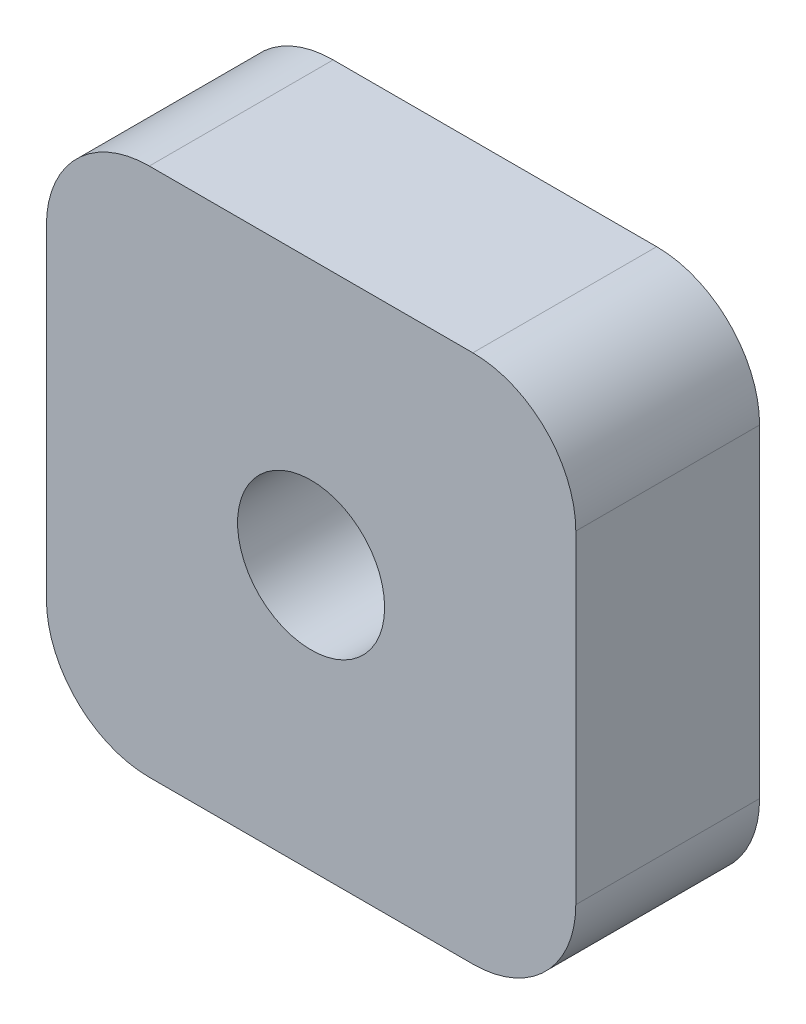
ISO-10303-21;
HEADER;
FILE_DESCRIPTION(('STEP AP214'),'2;1');
FILE_NAME('part.step','',(''),(''),'','','');
FILE_SCHEMA(('AUTOMOTIVE_DESIGN { 1 0 10303 214 1 1 1 1 }'));
ENDSEC;
DATA;
#1=APPLICATION_CONTEXT('core data for automotive mechanical design processes');
#2=APPLICATION_PROTOCOL_DEFINITION('international standard','automotive_design',2000,#1);
#3=PRODUCT_CONTEXT('',#1,'mechanical');
#4=PRODUCT('Part','Part','',(#3));
#5=PRODUCT_RELATED_PRODUCT_CATEGORY('part','',(#4));
#6=PRODUCT_DEFINITION_FORMATION('','',#4);
#7=PRODUCT_DEFINITION_CONTEXT('part definition',#1,'design');
#8=PRODUCT_DEFINITION('design','',#6,#7);
#9=PRODUCT_DEFINITION_SHAPE('','',#8);
#10=(LENGTH_UNIT() NAMED_UNIT(*) SI_UNIT(.MILLI.,.METRE.));
#11=(NAMED_UNIT(*) PLANE_ANGLE_UNIT() SI_UNIT($,.RADIAN.));
#12=(NAMED_UNIT(*) SI_UNIT($,.STERADIAN.) SOLID_ANGLE_UNIT());
#13=UNCERTAINTY_MEASURE_WITH_UNIT(LENGTH_MEASURE(1.E-05),#10,'distance_accuracy_value','');
#14=(GEOMETRIC_REPRESENTATION_CONTEXT(3) GLOBAL_UNCERTAINTY_ASSIGNED_CONTEXT((#13)) GLOBAL_UNIT_ASSIGNED_CONTEXT((#10,
#11,#12)) REPRESENTATION_CONTEXT('',''));
#15=CARTESIAN_POINT('',(0.,0.,0.));
#16=DIRECTION('',(0.,0.,1.));
#17=DIRECTION('',(1.,0.,0.));
#18=AXIS2_PLACEMENT_3D('',#15,#16,#17);
#19=CARTESIAN_POINT('',(-11.,-11.,0.));
#20=DIRECTION('',(0.,0.,1.));
#21=DIRECTION('',(1.,0.,0.));
#22=AXIS2_PLACEMENT_3D('',#19,#20,#21);
#23=PLANE('',#22);
#24=CARTESIAN_POINT('',(-11.,11.,0.));
#25=DIRECTION('',(0.,0.,-1.));
#26=DIRECTION('',(-1.,0.,0.));
#27=AXIS2_PLACEMENT_3D('',#24,#25,#26);
#28=CIRCLE('',#27,2.);
#29=CARTESIAN_POINT('',(-13.,11.,0.));
#30=VERTEX_POINT('',#29);
#31=EDGE_CURVE('E229',#30,#30,#28,.T.);
#32=ORIENTED_EDGE('',*,*,#31,.F.);
#33=EDGE_LOOP('',(#32));
#34=FACE_BOUND('',#33,.T.);
#35=CARTESIAN_POINT('',(11.,-11.,0.));
#36=DIRECTION('',(0.,0.,-1.));
#37=DIRECTION('',(-1.,0.,0.));
#38=AXIS2_PLACEMENT_3D('',#35,#36,#37);
#39=CIRCLE('',#38,2.);
#40=CARTESIAN_POINT('',(9.00000000000001,-11.,0.));
#41=VERTEX_POINT('',#40);
#42=EDGE_CURVE('E212',#41,#41,#39,.T.);
#43=ORIENTED_EDGE('',*,*,#42,.F.);
#44=EDGE_LOOP('',(#43));
#45=FACE_BOUND('',#44,.T.);
#46=CARTESIAN_POINT('',(11.,11.,0.));
#47=DIRECTION('',(0.,0.,-1.));
#48=DIRECTION('',(-1.,0.,0.));
#49=AXIS2_PLACEMENT_3D('',#46,#47,#48);
#50=CIRCLE('',#49,2.);
#51=CARTESIAN_POINT('',(9.00000000000004,11.,0.));
#52=VERTEX_POINT('',#51);
#53=EDGE_CURVE('E205',#52,#52,#50,.T.);
#54=ORIENTED_EDGE('',*,*,#53,.F.);
#55=EDGE_LOOP('',(#54));
#56=FACE_BOUND('',#55,.T.);
#57=CARTESIAN_POINT('',(-11.,-11.,0.));
#58=DIRECTION('',(0.,0.,1.));
#59=DIRECTION('',(1.,0.,0.));
#60=AXIS2_PLACEMENT_3D('',#57,#58,#59);
#61=CIRCLE('',#60,7.);
#62=CARTESIAN_POINT('',(-18.,-11.,0.));
#63=VERTEX_POINT('',#62);
#64=CARTESIAN_POINT('',(-11.,-18.,0.));
#65=VERTEX_POINT('',#64);
#66=EDGE_CURVE('E136',#63,#65,#61,.T.);
#67=ORIENTED_EDGE('',*,*,#66,.F.);
#68=DIRECTION('',(0.,-1.,0.));
#69=VECTOR('',#68,1.);
#70=CARTESIAN_POINT('',(-18.,11.,0.));
#71=LINE('',#70,#69);
#72=CARTESIAN_POINT('',(-18.,11.,0.));
#73=VERTEX_POINT('',#72);
#74=EDGE_CURVE('E95',#73,#63,#71,.T.);
#75=ORIENTED_EDGE('',*,*,#74,.F.);
#76=CARTESIAN_POINT('',(-11.,11.,0.));
#77=DIRECTION('',(0.,0.,1.));
#78=DIRECTION('',(1.,0.,0.));
#79=AXIS2_PLACEMENT_3D('',#76,#77,#78);
#80=CIRCLE('',#79,7.);
#81=CARTESIAN_POINT('',(-11.,18.,0.));
#82=VERTEX_POINT('',#81);
#83=EDGE_CURVE('E88',#82,#73,#80,.T.);
#84=ORIENTED_EDGE('',*,*,#83,.F.);
#85=DIRECTION('',(-1.,0.,0.));
#86=VECTOR('',#85,1.);
#87=CARTESIAN_POINT('',(-11.,18.,0.));
#88=LINE('',#87,#86);
#89=CARTESIAN_POINT('',(11.,18.,0.));
#90=VERTEX_POINT('',#89);
#91=EDGE_CURVE('E128',#90,#82,#88,.T.);
#92=ORIENTED_EDGE('',*,*,#91,.F.);
#93=CARTESIAN_POINT('',(11.,11.,0.));
#94=DIRECTION('',(0.,0.,1.));
#95=DIRECTION('',(1.,0.,0.));
#96=AXIS2_PLACEMENT_3D('',#93,#94,#95);
#97=CIRCLE('',#96,7.);
#98=CARTESIAN_POINT('',(18.,11.,0.));
#99=VERTEX_POINT('',#98);
#100=EDGE_CURVE('E147',#99,#90,#97,.T.);
#101=ORIENTED_EDGE('',*,*,#100,.F.);
#102=DIRECTION('',(0.,1.,0.));
#103=VECTOR('',#102,1.);
#104=CARTESIAN_POINT('',(18.,11.,0.));
#105=LINE('',#104,#103);
#106=CARTESIAN_POINT('',(18.,-11.,0.));
#107=VERTEX_POINT('',#106);
#108=EDGE_CURVE('E146',#107,#99,#105,.T.);
#109=ORIENTED_EDGE('',*,*,#108,.F.);
#110=CARTESIAN_POINT('',(11.,-11.,0.));
#111=DIRECTION('',(0.,0.,1.));
#112=DIRECTION('',(1.,0.,0.));
#113=AXIS2_PLACEMENT_3D('',#110,#111,#112);
#114=CIRCLE('',#113,7.);
#115=CARTESIAN_POINT('',(11.,-18.,0.));
#116=VERTEX_POINT('',#115);
#117=EDGE_CURVE('E148',#116,#107,#114,.T.);
#118=ORIENTED_EDGE('',*,*,#117,.F.);
#119=DIRECTION('',(1.,0.,0.));
#120=VECTOR('',#119,1.);
#121=CARTESIAN_POINT('',(-11.,-18.,0.));
#122=LINE('',#121,#120);
#123=EDGE_CURVE('E141',#65,#116,#122,.T.);
#124=ORIENTED_EDGE('',*,*,#123,.F.);
#125=EDGE_LOOP('',(#67,#75,#84,#92,#101,#109,#118,#124));
#126=FACE_BOUND('',#125,.T.);
#127=CARTESIAN_POINT('',(0.,0.,0.));
#128=DIRECTION('',(0.,0.,1.));
#129=DIRECTION('',(1.,0.,0.));
#130=AXIS2_PLACEMENT_3D('',#127,#128,#129);
#131=CIRCLE('',#130,5.);
#132=CARTESIAN_POINT('',(5.00000000000001,0.,0.));
#133=VERTEX_POINT('',#132);
#134=EDGE_CURVE('E190',#133,#133,#131,.T.);
#135=ORIENTED_EDGE('',*,*,#134,.T.);
#136=EDGE_LOOP('',(#135));
#137=FACE_BOUND('',#136,.T.);
#138=CARTESIAN_POINT('',(-11.,-11.,0.));
#139=DIRECTION('',(0.,0.,-1.));
#140=DIRECTION('',(-1.,0.,0.));
#141=AXIS2_PLACEMENT_3D('',#138,#139,#140);
#142=CIRCLE('',#141,2.);
#143=CARTESIAN_POINT('',(-13.,-11.,0.));
#144=VERTEX_POINT('',#143);
#145=EDGE_CURVE('E236',#144,#144,#142,.T.);
#146=ORIENTED_EDGE('',*,*,#145,.F.);
#147=EDGE_LOOP('',(#146));
#148=FACE_BOUND('',#147,.T.);
#149=ADVANCED_FACE('F39',(#34,#45,#56,#126,#137,#148),#23,.F.);
#150=CARTESIAN_POINT('',(-11.,-11.,12.5));
#151=DIRECTION('',(0.,0.,1.));
#152=DIRECTION('',(1.,0.,0.));
#153=AXIS2_PLACEMENT_3D('',#150,#151,#152);
#154=PLANE('',#153);
#155=CARTESIAN_POINT('',(-11.,-11.,12.5));
#156=DIRECTION('',(0.,0.,1.));
#157=DIRECTION('',(1.,0.,0.));
#158=AXIS2_PLACEMENT_3D('',#155,#156,#157);
#159=CIRCLE('',#158,7.);
#160=CARTESIAN_POINT('',(-18.,-11.,12.5));
#161=VERTEX_POINT('',#160);
#162=CARTESIAN_POINT('',(-11.,-18.,12.5));
#163=VERTEX_POINT('',#162);
#164=EDGE_CURVE('E154',#161,#163,#159,.T.);
#165=ORIENTED_EDGE('',*,*,#164,.T.);
#166=DIRECTION('',(1.,0.,0.));
#167=VECTOR('',#166,1.);
#168=CARTESIAN_POINT('',(-11.,-18.,12.5));
#169=LINE('',#168,#167);
#170=CARTESIAN_POINT('',(11.,-18.,12.5));
#171=VERTEX_POINT('',#170);
#172=EDGE_CURVE('E99',#163,#171,#169,.T.);
#173=ORIENTED_EDGE('',*,*,#172,.T.);
#174=CARTESIAN_POINT('',(11.,-11.,12.5));
#175=DIRECTION('',(0.,0.,1.));
#176=DIRECTION('',(1.,0.,0.));
#177=AXIS2_PLACEMENT_3D('',#174,#175,#176);
#178=CIRCLE('',#177,7.);
#179=CARTESIAN_POINT('',(18.,-11.,12.5));
#180=VERTEX_POINT('',#179);
#181=EDGE_CURVE('E168',#171,#180,#178,.T.);
#182=ORIENTED_EDGE('',*,*,#181,.T.);
#183=DIRECTION('',(0.,1.,0.));
#184=VECTOR('',#183,1.);
#185=CARTESIAN_POINT('',(18.,11.,12.5));
#186=LINE('',#185,#184);
#187=CARTESIAN_POINT('',(18.,11.,12.5));
#188=VERTEX_POINT('',#187);
#189=EDGE_CURVE('E185',#180,#188,#186,.T.);
#190=ORIENTED_EDGE('',*,*,#189,.T.);
#191=CARTESIAN_POINT('',(11.,11.,12.5));
#192=DIRECTION('',(0.,0.,1.));
#193=DIRECTION('',(1.,0.,0.));
#194=AXIS2_PLACEMENT_3D('',#191,#192,#193);
#195=CIRCLE('',#194,7.);
#196=CARTESIAN_POINT('',(11.,18.,12.5));
#197=VERTEX_POINT('',#196);
#198=EDGE_CURVE('E124',#188,#197,#195,.T.);
#199=ORIENTED_EDGE('',*,*,#198,.T.);
#200=DIRECTION('',(-1.,0.,0.));
#201=VECTOR('',#200,1.);
#202=CARTESIAN_POINT('',(-11.,18.,12.5));
#203=LINE('',#202,#201);
#204=CARTESIAN_POINT('',(-11.,18.,12.5));
#205=VERTEX_POINT('',#204);
#206=EDGE_CURVE('E113',#197,#205,#203,.T.);
#207=ORIENTED_EDGE('',*,*,#206,.T.);
#208=CARTESIAN_POINT('',(-11.,11.,12.5));
#209=DIRECTION('',(0.,0.,1.));
#210=DIRECTION('',(1.,0.,0.));
#211=AXIS2_PLACEMENT_3D('',#208,#209,#210);
#212=CIRCLE('',#211,7.);
#213=CARTESIAN_POINT('',(-18.,11.,12.5));
#214=VERTEX_POINT('',#213);
#215=EDGE_CURVE('E117',#205,#214,#212,.T.);
#216=ORIENTED_EDGE('',*,*,#215,.T.);
#217=DIRECTION('',(0.,-1.,0.));
#218=VECTOR('',#217,1.);
#219=CARTESIAN_POINT('',(-18.,11.,12.5));
#220=LINE('',#219,#218);
#221=EDGE_CURVE('E57',#214,#161,#220,.T.);
#222=ORIENTED_EDGE('',*,*,#221,.T.);
#223=EDGE_LOOP('',(#165,#173,#182,#190,#199,#207,#216,#222));
#224=FACE_BOUND('',#223,.T.);
#225=CARTESIAN_POINT('',(0.,0.,12.5));
#226=DIRECTION('',(0.,0.,1.));
#227=DIRECTION('',(1.,0.,0.));
#228=AXIS2_PLACEMENT_3D('',#225,#226,#227);
#229=CIRCLE('',#228,5.);
#230=CARTESIAN_POINT('',(5.00000000000001,0.,12.5));
#231=VERTEX_POINT('',#230);
#232=EDGE_CURVE('E145',#231,#231,#229,.T.);
#233=ORIENTED_EDGE('',*,*,#232,.F.);
#234=EDGE_LOOP('',(#233));
#235=FACE_BOUND('',#234,.T.);
#236=ADVANCED_FACE('F116',(#224,#235),#154,.T.);
#237=CARTESIAN_POINT('',(-11.,-11.,12.5));
#238=DIRECTION('',(0.,0.,-1.));
#239=DIRECTION('',(-1.,0.,0.));
#240=AXIS2_PLACEMENT_3D('',#237,#238,#239);
#241=CYLINDRICAL_SURFACE('',#240,7.);
#242=ORIENTED_EDGE('',*,*,#66,.T.);
#243=DIRECTION('',(0.,0.,-1.));
#244=VECTOR('',#243,1.);
#245=CARTESIAN_POINT('',(-11.,-18.,12.5));
#246=LINE('',#245,#244);
#247=EDGE_CURVE('E11',#163,#65,#246,.T.);
#248=ORIENTED_EDGE('',*,*,#247,.F.);
#249=ORIENTED_EDGE('',*,*,#164,.F.);
#250=DIRECTION('',(0.,0.,-1.));
#251=VECTOR('',#250,1.);
#252=CARTESIAN_POINT('',(-18.,-11.,12.5));
#253=LINE('',#252,#251);
#254=EDGE_CURVE('E138',#161,#63,#253,.T.);
#255=ORIENTED_EDGE('',*,*,#254,.T.);
#256=EDGE_LOOP('',(#242,#248,#249,#255));
#257=FACE_BOUND('',#256,.T.);
#258=ADVANCED_FACE('F41',(#257),#241,.T.);
#259=CARTESIAN_POINT('',(-11.,-18.,12.5));
#260=DIRECTION('',(0.,1.,0.));
#261=DIRECTION('',(-1.,0.,0.));
#262=AXIS2_PLACEMENT_3D('',#259,#260,#261);
#263=PLANE('',#262);
#264=ORIENTED_EDGE('',*,*,#123,.T.);
#265=DIRECTION('',(0.,0.,-1.));
#266=VECTOR('',#265,1.);
#267=CARTESIAN_POINT('',(11.,-18.,12.5));
#268=LINE('',#267,#266);
#269=EDGE_CURVE('E48',#171,#116,#268,.T.);
#270=ORIENTED_EDGE('',*,*,#269,.F.);
#271=ORIENTED_EDGE('',*,*,#172,.F.);
#272=ORIENTED_EDGE('',*,*,#247,.T.);
#273=EDGE_LOOP('',(#264,#270,#271,#272));
#274=FACE_BOUND('',#273,.T.);
#275=ADVANCED_FACE('F269',(#274),#263,.F.);
#276=CARTESIAN_POINT('',(11.,-11.,12.5));
#277=DIRECTION('',(0.,0.,-1.));
#278=DIRECTION('',(-1.,0.,0.));
#279=AXIS2_PLACEMENT_3D('',#276,#277,#278);
#280=CYLINDRICAL_SURFACE('',#279,7.);
#281=ORIENTED_EDGE('',*,*,#117,.T.);
#282=DIRECTION('',(0.,0.,-1.));
#283=VECTOR('',#282,1.);
#284=CARTESIAN_POINT('',(18.,-11.,12.5));
#285=LINE('',#284,#283);
#286=EDGE_CURVE('E165',#180,#107,#285,.T.);
#287=ORIENTED_EDGE('',*,*,#286,.F.);
#288=ORIENTED_EDGE('',*,*,#181,.F.);
#289=ORIENTED_EDGE('',*,*,#269,.T.);
#290=EDGE_LOOP('',(#281,#287,#288,#289));
#291=FACE_BOUND('',#290,.T.);
#292=ADVANCED_FACE('F169',(#291),#280,.T.);
#293=CARTESIAN_POINT('',(18.,11.,12.5));
#294=DIRECTION('',(-1.,0.,0.));
#295=DIRECTION('',(0.,-1.,0.));
#296=AXIS2_PLACEMENT_3D('',#293,#294,#295);
#297=PLANE('',#296);
#298=ORIENTED_EDGE('',*,*,#108,.T.);
#299=DIRECTION('',(0.,0.,-1.));
#300=VECTOR('',#299,1.);
#301=CARTESIAN_POINT('',(18.,11.,12.5));
#302=LINE('',#301,#300);
#303=EDGE_CURVE('E157',#188,#99,#302,.T.);
#304=ORIENTED_EDGE('',*,*,#303,.F.);
#305=ORIENTED_EDGE('',*,*,#189,.F.);
#306=ORIENTED_EDGE('',*,*,#286,.T.);
#307=EDGE_LOOP('',(#298,#304,#305,#306));
#308=FACE_BOUND('',#307,.T.);
#309=ADVANCED_FACE('F177',(#308),#297,.F.);
#310=CARTESIAN_POINT('',(11.,11.,12.5));
#311=DIRECTION('',(0.,0.,-1.));
#312=DIRECTION('',(-1.,0.,0.));
#313=AXIS2_PLACEMENT_3D('',#310,#311,#312);
#314=CYLINDRICAL_SURFACE('',#313,7.);
#315=ORIENTED_EDGE('',*,*,#100,.T.);
#316=DIRECTION('',(0.,0.,-1.));
#317=VECTOR('',#316,1.);
#318=CARTESIAN_POINT('',(11.,18.,12.5));
#319=LINE('',#318,#317);
#320=EDGE_CURVE('E134',#197,#90,#319,.T.);
#321=ORIENTED_EDGE('',*,*,#320,.F.);
#322=ORIENTED_EDGE('',*,*,#198,.F.);
#323=ORIENTED_EDGE('',*,*,#303,.T.);
#324=EDGE_LOOP('',(#315,#321,#322,#323));
#325=FACE_BOUND('',#324,.T.);
#326=ADVANCED_FACE('F182',(#325),#314,.T.);
#327=CARTESIAN_POINT('',(-11.,18.,12.5));
#328=DIRECTION('',(0.,-1.,0.));
#329=DIRECTION('',(1.,0.,0.));
#330=AXIS2_PLACEMENT_3D('',#327,#328,#329);
#331=PLANE('',#330);
#332=ORIENTED_EDGE('',*,*,#91,.T.);
#333=DIRECTION('',(0.,0.,-1.));
#334=VECTOR('',#333,1.);
#335=CARTESIAN_POINT('',(-11.,18.,12.5));
#336=LINE('',#335,#334);
#337=EDGE_CURVE('E130',#205,#82,#336,.T.);
#338=ORIENTED_EDGE('',*,*,#337,.F.);
#339=ORIENTED_EDGE('',*,*,#206,.F.);
#340=ORIENTED_EDGE('',*,*,#320,.T.);
#341=EDGE_LOOP('',(#332,#338,#339,#340));
#342=FACE_BOUND('',#341,.T.);
#343=ADVANCED_FACE('F126',(#342),#331,.F.);
#344=CARTESIAN_POINT('',(-11.,11.,12.5));
#345=DIRECTION('',(0.,0.,-1.));
#346=DIRECTION('',(-1.,0.,0.));
#347=AXIS2_PLACEMENT_3D('',#344,#345,#346);
#348=CYLINDRICAL_SURFACE('',#347,7.);
#349=ORIENTED_EDGE('',*,*,#83,.T.);
#350=DIRECTION('',(0.,0.,-1.));
#351=VECTOR('',#350,1.);
#352=CARTESIAN_POINT('',(-18.,11.,12.5));
#353=LINE('',#352,#351);
#354=EDGE_CURVE('E131',#214,#73,#353,.T.);
#355=ORIENTED_EDGE('',*,*,#354,.F.);
#356=ORIENTED_EDGE('',*,*,#215,.F.);
#357=ORIENTED_EDGE('',*,*,#337,.T.);
#358=EDGE_LOOP('',(#349,#355,#356,#357));
#359=FACE_BOUND('',#358,.T.);
#360=ADVANCED_FACE('F133',(#359),#348,.T.);
#361=CARTESIAN_POINT('',(-18.,11.,12.5));
#362=DIRECTION('',(1.,0.,0.));
#363=DIRECTION('',(0.,0.,-1.));
#364=AXIS2_PLACEMENT_3D('',#361,#362,#363);
#365=PLANE('',#364);
#366=ORIENTED_EDGE('',*,*,#74,.T.);
#367=ORIENTED_EDGE('',*,*,#254,.F.);
#368=ORIENTED_EDGE('',*,*,#221,.F.);
#369=ORIENTED_EDGE('',*,*,#354,.T.);
#370=EDGE_LOOP('',(#366,#367,#368,#369));
#371=FACE_BOUND('',#370,.T.);
#372=ADVANCED_FACE('F260',(#371),#365,.F.);
#373=CARTESIAN_POINT('',(0.,0.,12.5));
#374=DIRECTION('',(0.,0.,-1.));
#375=DIRECTION('',(-1.,0.,0.));
#376=AXIS2_PLACEMENT_3D('',#373,#374,#375);
#377=CYLINDRICAL_SURFACE('',#376,5.);
#378=ORIENTED_EDGE('',*,*,#232,.T.);
#379=EDGE_LOOP('',(#378));
#380=FACE_BOUND('',#379,.T.);
#381=ORIENTED_EDGE('',*,*,#134,.F.);
#382=EDGE_LOOP('',(#381));
#383=FACE_BOUND('',#382,.T.);
#384=ADVANCED_FACE('F257',(#380,#383),#377,.F.);
#385=CARTESIAN_POINT('',(11.,11.,7.));
#386=DIRECTION('',(0.,0.,-1.));
#387=DIRECTION('',(-1.,0.,0.));
#388=AXIS2_PLACEMENT_3D('',#385,#386,#387);
#389=CONICAL_SURFACE('',#388,1.65,1.02974425867665);
#390=CARTESIAN_POINT('',(11.,11.,7.99142002139547));
#391=VERTEX_POINT('',#390);
#392=VERTEX_LOOP('',#391);
#393=FACE_BOUND('',#392,.T.);
#394=CARTESIAN_POINT('',(11.,11.,7.));
#395=DIRECTION('',(0.,0.,-1.));
#396=DIRECTION('',(-1.,0.,0.));
#397=AXIS2_PLACEMENT_3D('',#394,#395,#396);
#398=CIRCLE('',#397,1.65);
#399=CARTESIAN_POINT('',(9.35000000000004,11.,7.));
#400=VERTEX_POINT('',#399);
#401=EDGE_CURVE('E193',#400,#400,#398,.T.);
#402=ORIENTED_EDGE('',*,*,#401,.T.);
#403=EDGE_LOOP('',(#402));
#404=FACE_BOUND('',#403,.T.);
#405=ADVANCED_FACE('F330',(#393,#404),#389,.F.);
#406=CARTESIAN_POINT('',(11.,11.,0.));
#407=DIRECTION('',(0.,0.,-1.));
#408=DIRECTION('',(-1.,0.,0.));
#409=AXIS2_PLACEMENT_3D('',#406,#407,#408);
#410=CYLINDRICAL_SURFACE('',#409,1.65);
#411=ORIENTED_EDGE('',*,*,#401,.F.);
#412=EDGE_LOOP('',(#411));
#413=FACE_BOUND('',#412,.T.);
#414=CARTESIAN_POINT('',(11.,11.,4.));
#415=DIRECTION('',(0.,0.,-1.));
#416=DIRECTION('',(-1.,0.,0.));
#417=AXIS2_PLACEMENT_3D('',#414,#415,#416);
#418=CIRCLE('',#417,1.65);
#419=CARTESIAN_POINT('',(9.35000000000004,11.,4.));
#420=VERTEX_POINT('',#419);
#421=EDGE_CURVE('E198',#420,#420,#418,.T.);
#422=ORIENTED_EDGE('',*,*,#421,.T.);
#423=EDGE_LOOP('',(#422));
#424=FACE_BOUND('',#423,.T.);
#425=ADVANCED_FACE('F338',(#413,#424),#410,.F.);
#426=CARTESIAN_POINT('',(12.65,11.,4.));
#427=DIRECTION('',(0.,0.,1.));
#428=DIRECTION('',(1.,0.,0.));
#429=AXIS2_PLACEMENT_3D('',#426,#427,#428);
#430=PLANE('',#429);
#431=ORIENTED_EDGE('',*,*,#421,.F.);
#432=EDGE_LOOP('',(#431));
#433=FACE_BOUND('',#432,.T.);
#434=CARTESIAN_POINT('',(11.,11.,4.));
#435=DIRECTION('',(0.,0.,-1.));
#436=DIRECTION('',(-1.,0.,0.));
#437=AXIS2_PLACEMENT_3D('',#434,#435,#436);
#438=CIRCLE('',#437,2.);
#439=CARTESIAN_POINT('',(9.00000000000004,11.,4.));
#440=VERTEX_POINT('',#439);
#441=EDGE_CURVE('E200',#440,#440,#438,.T.);
#442=ORIENTED_EDGE('',*,*,#441,.T.);
#443=EDGE_LOOP('',(#442));
#444=FACE_BOUND('',#443,.T.);
#445=ADVANCED_FACE('F346',(#433,#444),#430,.F.);
#446=CARTESIAN_POINT('',(11.,11.,0.));
#447=DIRECTION('',(0.,0.,-1.));
#448=DIRECTION('',(-1.,0.,0.));
#449=AXIS2_PLACEMENT_3D('',#446,#447,#448);
#450=CYLINDRICAL_SURFACE('',#449,2.);
#451=ORIENTED_EDGE('',*,*,#441,.F.);
#452=EDGE_LOOP('',(#451));
#453=FACE_BOUND('',#452,.T.);
#454=ORIENTED_EDGE('',*,*,#53,.T.);
#455=EDGE_LOOP('',(#454));
#456=FACE_BOUND('',#455,.T.);
#457=ADVANCED_FACE('F359',(#453,#456),#450,.F.);
#458=CARTESIAN_POINT('',(11.,-11.,7.));
#459=DIRECTION('',(0.,0.,-1.));
#460=DIRECTION('',(-1.,0.,0.));
#461=AXIS2_PLACEMENT_3D('',#458,#459,#460);
#462=CONICAL_SURFACE('',#461,1.65,1.02974425867665);
#463=CARTESIAN_POINT('',(11.,-11.,7.99142002139547));
#464=VERTEX_POINT('',#463);
#465=VERTEX_LOOP('',#464);
#466=FACE_BOUND('',#465,.T.);
#467=CARTESIAN_POINT('',(11.,-11.,7.));
#468=DIRECTION('',(0.,0.,-1.));
#469=DIRECTION('',(-1.,0.,0.));
#470=AXIS2_PLACEMENT_3D('',#467,#468,#469);
#471=CIRCLE('',#470,1.65);
#472=CARTESIAN_POINT('',(9.35000000000001,-11.,7.));
#473=VERTEX_POINT('',#472);
#474=EDGE_CURVE('E202',#473,#473,#471,.T.);
#475=ORIENTED_EDGE('',*,*,#474,.T.);
#476=EDGE_LOOP('',(#475));
#477=FACE_BOUND('',#476,.T.);
#478=ADVANCED_FACE('F368',(#466,#477),#462,.F.);
#479=CARTESIAN_POINT('',(11.,-11.,0.));
#480=DIRECTION('',(0.,0.,-1.));
#481=DIRECTION('',(-1.,0.,0.));
#482=AXIS2_PLACEMENT_3D('',#479,#480,#481);
#483=CYLINDRICAL_SURFACE('',#482,1.65);
#484=ORIENTED_EDGE('',*,*,#474,.F.);
#485=EDGE_LOOP('',(#484));
#486=FACE_BOUND('',#485,.T.);
#487=CARTESIAN_POINT('',(11.,-11.,4.));
#488=DIRECTION('',(0.,0.,-1.));
#489=DIRECTION('',(-1.,0.,0.));
#490=AXIS2_PLACEMENT_3D('',#487,#488,#489);
#491=CIRCLE('',#490,1.65);
#492=CARTESIAN_POINT('',(9.35000000000001,-11.,4.));
#493=VERTEX_POINT('',#492);
#494=EDGE_CURVE('E208',#493,#493,#491,.T.);
#495=ORIENTED_EDGE('',*,*,#494,.T.);
#496=EDGE_LOOP('',(#495));
#497=FACE_BOUND('',#496,.T.);
#498=ADVANCED_FACE('F374',(#486,#497),#483,.F.);
#499=CARTESIAN_POINT('',(12.65,-11.,4.));
#500=DIRECTION('',(0.,0.,1.));
#501=DIRECTION('',(1.,0.,0.));
#502=AXIS2_PLACEMENT_3D('',#499,#500,#501);
#503=PLANE('',#502);
#504=ORIENTED_EDGE('',*,*,#494,.F.);
#505=EDGE_LOOP('',(#504));
#506=FACE_BOUND('',#505,.T.);
#507=CARTESIAN_POINT('',(11.,-11.,4.));
#508=DIRECTION('',(0.,0.,-1.));
#509=DIRECTION('',(-1.,0.,0.));
#510=AXIS2_PLACEMENT_3D('',#507,#508,#509);
#511=CIRCLE('',#510,2.);
#512=CARTESIAN_POINT('',(9.00000000000001,-11.,4.));
#513=VERTEX_POINT('',#512);
#514=EDGE_CURVE('E211',#513,#513,#511,.T.);
#515=ORIENTED_EDGE('',*,*,#514,.T.);
#516=EDGE_LOOP('',(#515));
#517=FACE_BOUND('',#516,.T.);
#518=ADVANCED_FACE('F383',(#506,#517),#503,.F.);
#519=CARTESIAN_POINT('',(11.,-11.,0.));
#520=DIRECTION('',(0.,0.,-1.));
#521=DIRECTION('',(-1.,0.,0.));
#522=AXIS2_PLACEMENT_3D('',#519,#520,#521);
#523=CYLINDRICAL_SURFACE('',#522,2.);
#524=ORIENTED_EDGE('',*,*,#514,.F.);
#525=EDGE_LOOP('',(#524));
#526=FACE_BOUND('',#525,.T.);
#527=ORIENTED_EDGE('',*,*,#42,.T.);
#528=EDGE_LOOP('',(#527));
#529=FACE_BOUND('',#528,.T.);
#530=ADVANCED_FACE('F395',(#526,#529),#523,.F.);
#531=CARTESIAN_POINT('',(-11.,11.,7.));
#532=DIRECTION('',(0.,0.,-1.));
#533=DIRECTION('',(-1.,0.,0.));
#534=AXIS2_PLACEMENT_3D('',#531,#532,#533);
#535=CONICAL_SURFACE('',#534,1.65,1.02974425867665);
#536=CARTESIAN_POINT('',(-11.,11.,7.99142002139547));
#537=VERTEX_POINT('',#536);
#538=VERTEX_LOOP('',#537);
#539=FACE_BOUND('',#538,.T.);
#540=CARTESIAN_POINT('',(-11.,11.,7.));
#541=DIRECTION('',(0.,0.,-1.));
#542=DIRECTION('',(-1.,0.,0.));
#543=AXIS2_PLACEMENT_3D('',#540,#541,#542);
#544=CIRCLE('',#543,1.65);
#545=CARTESIAN_POINT('',(-12.65,11.,7.));
#546=VERTEX_POINT('',#545);
#547=EDGE_CURVE('E220',#546,#546,#544,.T.);
#548=ORIENTED_EDGE('',*,*,#547,.T.);
#549=EDGE_LOOP('',(#548));
#550=FACE_BOUND('',#549,.T.);
#551=ADVANCED_FACE('F405',(#539,#550),#535,.F.);
#552=CARTESIAN_POINT('',(-11.,11.,0.));
#553=DIRECTION('',(0.,0.,-1.));
#554=DIRECTION('',(-1.,0.,0.));
#555=AXIS2_PLACEMENT_3D('',#552,#553,#554);
#556=CYLINDRICAL_SURFACE('',#555,1.65);
#557=ORIENTED_EDGE('',*,*,#547,.F.);
#558=EDGE_LOOP('',(#557));
#559=FACE_BOUND('',#558,.T.);
#560=CARTESIAN_POINT('',(-11.,11.,4.));
#561=DIRECTION('',(0.,0.,-1.));
#562=DIRECTION('',(-1.,0.,0.));
#563=AXIS2_PLACEMENT_3D('',#560,#561,#562);
#564=CIRCLE('',#563,1.65);
#565=CARTESIAN_POINT('',(-12.65,11.,4.));
#566=VERTEX_POINT('',#565);
#567=EDGE_CURVE('E219',#566,#566,#564,.T.);
#568=ORIENTED_EDGE('',*,*,#567,.T.);
#569=EDGE_LOOP('',(#568));
#570=FACE_BOUND('',#569,.T.);
#571=ADVANCED_FACE('F413',(#559,#570),#556,.F.);
#572=CARTESIAN_POINT('',(-9.35000000000002,11.,4.));
#573=DIRECTION('',(0.,0.,1.));
#574=DIRECTION('',(1.,0.,0.));
#575=AXIS2_PLACEMENT_3D('',#572,#573,#574);
#576=PLANE('',#575);
#577=ORIENTED_EDGE('',*,*,#567,.F.);
#578=EDGE_LOOP('',(#577));
#579=FACE_BOUND('',#578,.T.);
#580=CARTESIAN_POINT('',(-11.,11.,4.));
#581=DIRECTION('',(0.,0.,-1.));
#582=DIRECTION('',(-1.,0.,0.));
#583=AXIS2_PLACEMENT_3D('',#580,#581,#582);
#584=CIRCLE('',#583,2.);
#585=CARTESIAN_POINT('',(-13.,11.,4.));
#586=VERTEX_POINT('',#585);
#587=EDGE_CURVE('E224',#586,#586,#584,.T.);
#588=ORIENTED_EDGE('',*,*,#587,.T.);
#589=EDGE_LOOP('',(#588));
#590=FACE_BOUND('',#589,.T.);
#591=ADVANCED_FACE('F419',(#579,#590),#576,.F.);
#592=CARTESIAN_POINT('',(-11.,11.,0.));
#593=DIRECTION('',(0.,0.,-1.));
#594=DIRECTION('',(-1.,0.,0.));
#595=AXIS2_PLACEMENT_3D('',#592,#593,#594);
#596=CYLINDRICAL_SURFACE('',#595,2.);
#597=ORIENTED_EDGE('',*,*,#587,.F.);
#598=EDGE_LOOP('',(#597));
#599=FACE_BOUND('',#598,.T.);
#600=ORIENTED_EDGE('',*,*,#31,.T.);
#601=EDGE_LOOP('',(#600));
#602=FACE_BOUND('',#601,.T.);
#603=ADVANCED_FACE('F427',(#599,#602),#596,.F.);
#604=CARTESIAN_POINT('',(-11.,-11.,7.));
#605=DIRECTION('',(0.,0.,-1.));
#606=DIRECTION('',(-1.,0.,0.));
#607=AXIS2_PLACEMENT_3D('',#604,#605,#606);
#608=CONICAL_SURFACE('',#607,1.65,1.02974425867665);
#609=CARTESIAN_POINT('',(-11.,-11.,7.99142002139547));
#610=VERTEX_POINT('',#609);
#611=VERTEX_LOOP('',#610);
#612=FACE_BOUND('',#611,.T.);
#613=CARTESIAN_POINT('',(-11.,-11.,7.));
#614=DIRECTION('',(0.,0.,-1.));
#615=DIRECTION('',(-1.,0.,0.));
#616=AXIS2_PLACEMENT_3D('',#613,#614,#615);
#617=CIRCLE('',#616,1.65);
#618=CARTESIAN_POINT('',(-12.65,-11.,7.));
#619=VERTEX_POINT('',#618);
#620=EDGE_CURVE('E228',#619,#619,#617,.T.);
#621=ORIENTED_EDGE('',*,*,#620,.T.);
#622=EDGE_LOOP('',(#621));
#623=FACE_BOUND('',#622,.T.);
#624=ADVANCED_FACE('F437',(#612,#623),#608,.F.);
#625=CARTESIAN_POINT('',(-11.,-11.,0.));
#626=DIRECTION('',(0.,0.,-1.));
#627=DIRECTION('',(-1.,0.,0.));
#628=AXIS2_PLACEMENT_3D('',#625,#626,#627);
#629=CYLINDRICAL_SURFACE('',#628,1.65);
#630=ORIENTED_EDGE('',*,*,#620,.F.);
#631=EDGE_LOOP('',(#630));
#632=FACE_BOUND('',#631,.T.);
#633=CARTESIAN_POINT('',(-11.,-11.,4.));
#634=DIRECTION('',(0.,0.,-1.));
#635=DIRECTION('',(-1.,0.,0.));
#636=AXIS2_PLACEMENT_3D('',#633,#634,#635);
#637=CIRCLE('',#636,1.65);
#638=CARTESIAN_POINT('',(-12.65,-11.,4.));
#639=VERTEX_POINT('',#638);
#640=EDGE_CURVE('E234',#639,#639,#637,.T.);
#641=ORIENTED_EDGE('',*,*,#640,.T.);
#642=EDGE_LOOP('',(#641));
#643=FACE_BOUND('',#642,.T.);
#644=ADVANCED_FACE('F446',(#632,#643),#629,.F.);
#645=CARTESIAN_POINT('',(-9.35,-11.,4.));
#646=DIRECTION('',(0.,0.,1.));
#647=DIRECTION('',(1.,0.,0.));
#648=AXIS2_PLACEMENT_3D('',#645,#646,#647);
#649=PLANE('',#648);
#650=ORIENTED_EDGE('',*,*,#640,.F.);
#651=EDGE_LOOP('',(#650));
#652=FACE_BOUND('',#651,.T.);
#653=CARTESIAN_POINT('',(-11.,-11.,4.));
#654=DIRECTION('',(0.,0.,-1.));
#655=DIRECTION('',(-1.,0.,0.));
#656=AXIS2_PLACEMENT_3D('',#653,#654,#655);
#657=CIRCLE('',#656,2.);
#658=CARTESIAN_POINT('',(-13.,-11.,4.));
#659=VERTEX_POINT('',#658);
#660=EDGE_CURVE('E231',#659,#659,#657,.T.);
#661=ORIENTED_EDGE('',*,*,#660,.T.);
#662=EDGE_LOOP('',(#661));
#663=FACE_BOUND('',#662,.T.);
#664=ADVANCED_FACE('F457',(#652,#663),#649,.F.);
#665=CARTESIAN_POINT('',(-11.,-11.,0.));
#666=DIRECTION('',(0.,0.,-1.));
#667=DIRECTION('',(-1.,0.,0.));
#668=AXIS2_PLACEMENT_3D('',#665,#666,#667);
#669=CYLINDRICAL_SURFACE('',#668,2.);
#670=ORIENTED_EDGE('',*,*,#660,.F.);
#671=EDGE_LOOP('',(#670));
#672=FACE_BOUND('',#671,.T.);
#673=ORIENTED_EDGE('',*,*,#145,.T.);
#674=EDGE_LOOP('',(#673));
#675=FACE_BOUND('',#674,.T.);
#676=ADVANCED_FACE('F241',(#672,#675),#669,.F.);
#677=CLOSED_SHELL('',(#149,#236,#258,#275,#292,#309,#326,#343,#360,#372,#384,#405,#425,#445,
#457,#478,#498,#518,#530,#551,#571,#591,#603,#624,#644,#664,#676));
#678=MANIFOLD_SOLID_BREP('B2',#677);
#679=ADVANCED_BREP_SHAPE_REPRESENTATION('',(#18,#678),#14);
#680=SHAPE_DEFINITION_REPRESENTATION(#9,#679);
ENDSEC;
END-ISO-10303-21;
